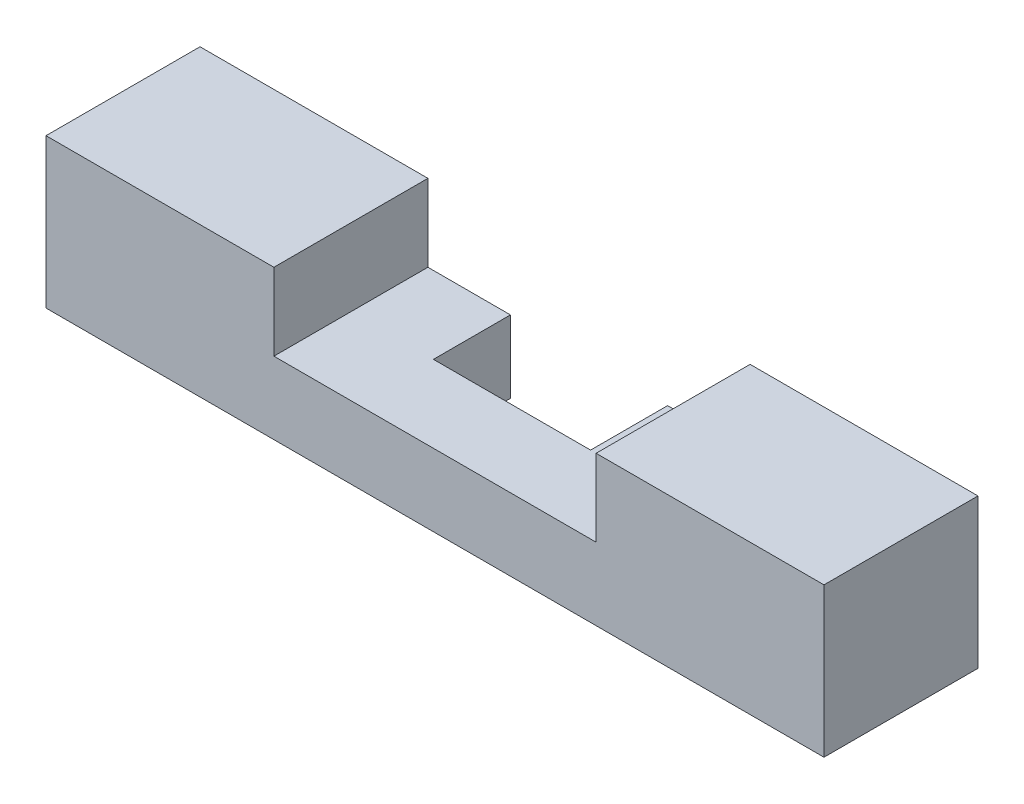
ISO-10303-21;
HEADER;
FILE_DESCRIPTION(('STEP AP214'),'2;1');
FILE_NAME('part.step','',(''),(''),'','','');
FILE_SCHEMA(('AUTOMOTIVE_DESIGN { 1 0 10303 214 1 1 1 1 }'));
ENDSEC;
DATA;
#1=APPLICATION_CONTEXT('core data for automotive mechanical design processes');
#2=APPLICATION_PROTOCOL_DEFINITION('international standard','automotive_design',2000,#1);
#3=PRODUCT_CONTEXT('',#1,'mechanical');
#4=PRODUCT('Part','Part','',(#3));
#5=PRODUCT_RELATED_PRODUCT_CATEGORY('part','',(#4));
#6=PRODUCT_DEFINITION_FORMATION('','',#4);
#7=PRODUCT_DEFINITION_CONTEXT('part definition',#1,'design');
#8=PRODUCT_DEFINITION('design','',#6,#7);
#9=PRODUCT_DEFINITION_SHAPE('','',#8);
#10=(LENGTH_UNIT() NAMED_UNIT(*) SI_UNIT(.MILLI.,.METRE.));
#11=(NAMED_UNIT(*) PLANE_ANGLE_UNIT() SI_UNIT($,.RADIAN.));
#12=(NAMED_UNIT(*) SI_UNIT($,.STERADIAN.) SOLID_ANGLE_UNIT());
#13=UNCERTAINTY_MEASURE_WITH_UNIT(LENGTH_MEASURE(1.E-05),#10,'distance_accuracy_value','');
#14=(GEOMETRIC_REPRESENTATION_CONTEXT(3) GLOBAL_UNCERTAINTY_ASSIGNED_CONTEXT((#13)) GLOBAL_UNIT_ASSIGNED_CONTEXT((#10,
#11,#12)) REPRESENTATION_CONTEXT('',''));
#15=CARTESIAN_POINT('',(0.,0.,0.));
#16=DIRECTION('',(0.,0.,1.));
#17=DIRECTION('',(1.,0.,0.));
#18=AXIS2_PLACEMENT_3D('',#15,#16,#17);
#19=CARTESIAN_POINT('',(0.,0.,0.));
#20=DIRECTION('',(0.,0.,1.));
#21=DIRECTION('',(1.,0.,0.));
#22=AXIS2_PLACEMENT_3D('',#19,#20,#21);
#23=PLANE('',#22);
#24=DIRECTION('',(0.,-1.,0.));
#25=VECTOR('',#24,1.);
#26=CARTESIAN_POINT('',(-10.,0.,0.));
#27=LINE('',#26,#25);
#28=CARTESIAN_POINT('',(-10.,-0.300000000000002,0.));
#29=VERTEX_POINT('',#28);
#30=CARTESIAN_POINT('',(-10.,-9.5,0.));
#31=VERTEX_POINT('',#30);
#32=EDGE_CURVE('E317',#29,#31,#27,.T.);
#33=ORIENTED_EDGE('',*,*,#32,.T.);
#34=DIRECTION('',(1.,0.,0.));
#35=VECTOR('',#34,1.);
#36=CARTESIAN_POINT('',(-49.5,-9.5,0.));
#37=LINE('',#36,#35);
#38=CARTESIAN_POINT('',(-49.5,-9.5,0.));
#39=VERTEX_POINT('',#38);
#40=EDGE_CURVE('E223',#39,#31,#37,.T.);
#41=ORIENTED_EDGE('',*,*,#40,.F.);
#42=DIRECTION('',(0.,-1.,0.));
#43=VECTOR('',#42,1.);
#44=CARTESIAN_POINT('',(-49.5,9.5,0.));
#45=LINE('',#44,#43);
#46=CARTESIAN_POINT('',(-49.5,9.5,0.));
#47=VERTEX_POINT('',#46);
#48=EDGE_CURVE('E365',#47,#39,#45,.T.);
#49=ORIENTED_EDGE('',*,*,#48,.F.);
#50=DIRECTION('',(-1.,0.,0.));
#51=VECTOR('',#50,1.);
#52=CARTESIAN_POINT('',(-49.5,9.5,0.));
#53=LINE('',#52,#51);
#54=CARTESIAN_POINT('',(-20.5,9.5,0.));
#55=VERTEX_POINT('',#54);
#56=EDGE_CURVE('E361',#55,#47,#53,.T.);
#57=ORIENTED_EDGE('',*,*,#56,.F.);
#58=DIRECTION('',(0.,1.,0.));
#59=VECTOR('',#58,1.);
#60=CARTESIAN_POINT('',(-20.5,-0.300000000000002,0.));
#61=LINE('',#60,#59);
#62=CARTESIAN_POINT('',(-20.5,-0.300000000000002,0.));
#63=VERTEX_POINT('',#62);
#64=EDGE_CURVE('E339',#63,#55,#61,.T.);
#65=ORIENTED_EDGE('',*,*,#64,.F.);
#66=DIRECTION('',(-1.,0.,0.));
#67=VECTOR('',#66,1.);
#68=CARTESIAN_POINT('',(20.5,-0.300000000000002,0.));
#69=LINE('',#68,#67);
#70=EDGE_CURVE('E332',#29,#63,#69,.T.);
#71=ORIENTED_EDGE('',*,*,#70,.F.);
#72=EDGE_LOOP('',(#33,#41,#49,#57,#65,#71));
#73=FACE_BOUND('',#72,.T.);
#74=ADVANCED_FACE('F34',(#73),#23,.F.);
#75=CARTESIAN_POINT('',(-49.5,-9.5,19.6));
#76=DIRECTION('',(0.,1.,0.));
#77=DIRECTION('',(0.,0.,1.));
#78=AXIS2_PLACEMENT_3D('',#75,#76,#77);
#79=PLANE('',#78);
#80=ORIENTED_EDGE('',*,*,#40,.T.);
#81=DIRECTION('',(0.,0.,1.));
#82=VECTOR('',#81,1.);
#83=CARTESIAN_POINT('',(-10.,-9.5,19.6));
#84=LINE('',#83,#82);
#85=CARTESIAN_POINT('',(-10.,-9.5,9.8));
#86=VERTEX_POINT('',#85);
#87=EDGE_CURVE('E203',#31,#86,#84,.T.);
#88=ORIENTED_EDGE('',*,*,#87,.T.);
#89=DIRECTION('',(1.,0.,0.));
#90=VECTOR('',#89,1.);
#91=CARTESIAN_POINT('',(-49.5,-9.5,9.8));
#92=LINE('',#91,#90);
#93=CARTESIAN_POINT('',(9.99999999999999,-9.5,9.8));
#94=VERTEX_POINT('',#93);
#95=EDGE_CURVE('E213',#86,#94,#92,.T.);
#96=ORIENTED_EDGE('',*,*,#95,.T.);
#97=DIRECTION('',(0.,0.,-1.));
#98=VECTOR('',#97,1.);
#99=CARTESIAN_POINT('',(9.99999999999999,-9.5,19.6));
#100=LINE('',#99,#98);
#101=CARTESIAN_POINT('',(9.99999999999999,-9.5,0.));
#102=VERTEX_POINT('',#101);
#103=EDGE_CURVE('E218',#94,#102,#100,.T.);
#104=ORIENTED_EDGE('',*,*,#103,.T.);
#105=CARTESIAN_POINT('',(49.5,-9.5,0.));
#106=VERTEX_POINT('',#105);
#107=EDGE_CURVE('E367',#102,#106,#37,.T.);
#108=ORIENTED_EDGE('',*,*,#107,.T.);
#109=DIRECTION('',(0.,0.,-1.));
#110=VECTOR('',#109,1.);
#111=CARTESIAN_POINT('',(49.5,-9.5,19.6));
#112=LINE('',#111,#110);
#113=CARTESIAN_POINT('',(49.5,-9.5,19.6));
#114=VERTEX_POINT('',#113);
#115=EDGE_CURVE('E359',#114,#106,#112,.T.);
#116=ORIENTED_EDGE('',*,*,#115,.F.);
#117=DIRECTION('',(1.,0.,0.));
#118=VECTOR('',#117,1.);
#119=CARTESIAN_POINT('',(-49.5,-9.5,19.6));
#120=LINE('',#119,#118);
#121=CARTESIAN_POINT('',(-49.5,-9.5,19.6));
#122=VERTEX_POINT('',#121);
#123=EDGE_CURVE('E357',#122,#114,#120,.T.);
#124=ORIENTED_EDGE('',*,*,#123,.F.);
#125=DIRECTION('',(0.,0.,-1.));
#126=VECTOR('',#125,1.);
#127=CARTESIAN_POINT('',(-49.5,-9.5,19.6));
#128=LINE('',#127,#126);
#129=EDGE_CURVE('E371',#122,#39,#128,.T.);
#130=ORIENTED_EDGE('',*,*,#129,.T.);
#131=EDGE_LOOP('',(#80,#88,#96,#104,#108,#116,#124,#130));
#132=FACE_BOUND('',#131,.T.);
#133=ADVANCED_FACE('F220',(#132),#79,.F.);
#134=CARTESIAN_POINT('',(-49.5,9.5,19.6));
#135=DIRECTION('',(0.,-1.,0.));
#136=DIRECTION('',(0.,0.,-1.));
#137=AXIS2_PLACEMENT_3D('',#134,#135,#136);
#138=PLANE('',#137);
#139=DIRECTION('',(-1.,0.,0.));
#140=VECTOR('',#139,1.);
#141=CARTESIAN_POINT('',(-49.5,9.5,19.6));
#142=LINE('',#141,#140);
#143=CARTESIAN_POINT('',(-20.5,9.5,19.6));
#144=VERTEX_POINT('',#143);
#145=CARTESIAN_POINT('',(-49.5,9.5,19.6));
#146=VERTEX_POINT('',#145);
#147=EDGE_CURVE('E351',#144,#146,#142,.T.);
#148=ORIENTED_EDGE('',*,*,#147,.F.);
#149=DIRECTION('',(0.,0.,1.));
#150=VECTOR('',#149,1.);
#151=CARTESIAN_POINT('',(-20.5,9.5,0.));
#152=LINE('',#151,#150);
#153=EDGE_CURVE('E322',#55,#144,#152,.T.);
#154=ORIENTED_EDGE('',*,*,#153,.F.);
#155=ORIENTED_EDGE('',*,*,#56,.T.);
#156=DIRECTION('',(0.,0.,-1.));
#157=VECTOR('',#156,1.);
#158=CARTESIAN_POINT('',(-49.5,9.5,19.6));
#159=LINE('',#158,#157);
#160=EDGE_CURVE('E373',#146,#47,#159,.T.);
#161=ORIENTED_EDGE('',*,*,#160,.F.);
#162=EDGE_LOOP('',(#148,#154,#155,#161));
#163=FACE_BOUND('',#162,.T.);
#164=ADVANCED_FACE('F392',(#163),#138,.F.);
#165=CARTESIAN_POINT('',(49.5,9.5,19.6));
#166=DIRECTION('',(-1.,0.,0.));
#167=DIRECTION('',(0.,0.,1.));
#168=AXIS2_PLACEMENT_3D('',#165,#166,#167);
#169=PLANE('',#168);
#170=DIRECTION('',(0.,0.,-1.));
#171=VECTOR('',#170,1.);
#172=CARTESIAN_POINT('',(49.5,9.5,19.6));
#173=LINE('',#172,#171);
#174=CARTESIAN_POINT('',(49.5,9.5,19.6));
#175=VERTEX_POINT('',#174);
#176=CARTESIAN_POINT('',(49.5,9.5,0.));
#177=VERTEX_POINT('',#176);
#178=EDGE_CURVE('E376',#175,#177,#173,.T.);
#179=ORIENTED_EDGE('',*,*,#178,.F.);
#180=DIRECTION('',(0.,1.,0.));
#181=VECTOR('',#180,1.);
#182=CARTESIAN_POINT('',(49.5,9.5,19.6));
#183=LINE('',#182,#181);
#184=EDGE_CURVE('E349',#114,#175,#183,.T.);
#185=ORIENTED_EDGE('',*,*,#184,.F.);
#186=ORIENTED_EDGE('',*,*,#115,.T.);
#187=DIRECTION('',(0.,1.,0.));
#188=VECTOR('',#187,1.);
#189=CARTESIAN_POINT('',(49.5,9.5,0.));
#190=LINE('',#189,#188);
#191=EDGE_CURVE('E341',#106,#177,#190,.T.);
#192=ORIENTED_EDGE('',*,*,#191,.T.);
#193=EDGE_LOOP('',(#179,#185,#186,#192));
#194=FACE_BOUND('',#193,.T.);
#195=ADVANCED_FACE('F36',(#194),#169,.F.);
#196=CARTESIAN_POINT('',(20.5,9.5,0.));
#197=VERTEX_POINT('',#196);
#198=EDGE_CURVE('E362',#177,#197,#53,.T.);
#199=ORIENTED_EDGE('',*,*,#198,.T.);
#200=DIRECTION('',(0.,0.,-1.));
#201=VECTOR('',#200,1.);
#202=CARTESIAN_POINT('',(20.5,9.5,0.));
#203=LINE('',#202,#201);
#204=CARTESIAN_POINT('',(20.5,9.5,19.6));
#205=VERTEX_POINT('',#204);
#206=EDGE_CURVE('E327',#205,#197,#203,.T.);
#207=ORIENTED_EDGE('',*,*,#206,.F.);
#208=EDGE_CURVE('E352',#175,#205,#142,.T.);
#209=ORIENTED_EDGE('',*,*,#208,.F.);
#210=ORIENTED_EDGE('',*,*,#178,.T.);
#211=EDGE_LOOP('',(#199,#207,#209,#210));
#212=FACE_BOUND('',#211,.T.);
#213=ADVANCED_FACE('F406',(#212),#138,.F.);
#214=CARTESIAN_POINT('',(-49.5,9.5,19.6));
#215=DIRECTION('',(1.,0.,0.));
#216=DIRECTION('',(0.,0.,-1.));
#217=AXIS2_PLACEMENT_3D('',#214,#215,#216);
#218=PLANE('',#217);
#219=ORIENTED_EDGE('',*,*,#48,.T.);
#220=ORIENTED_EDGE('',*,*,#129,.F.);
#221=DIRECTION('',(0.,-1.,0.));
#222=VECTOR('',#221,1.);
#223=CARTESIAN_POINT('',(-49.5,9.5,19.6));
#224=LINE('',#223,#222);
#225=EDGE_CURVE('E355',#146,#122,#224,.T.);
#226=ORIENTED_EDGE('',*,*,#225,.F.);
#227=ORIENTED_EDGE('',*,*,#160,.T.);
#228=EDGE_LOOP('',(#219,#220,#226,#227));
#229=FACE_BOUND('',#228,.T.);
#230=ADVANCED_FACE('F421',(#229),#218,.F.);
#231=CARTESIAN_POINT('',(0.,0.,19.6));
#232=DIRECTION('',(0.,0.,1.));
#233=DIRECTION('',(1.,0.,0.));
#234=AXIS2_PLACEMENT_3D('',#231,#232,#233);
#235=PLANE('',#234);
#236=ORIENTED_EDGE('',*,*,#225,.T.);
#237=ORIENTED_EDGE('',*,*,#123,.T.);
#238=ORIENTED_EDGE('',*,*,#184,.T.);
#239=ORIENTED_EDGE('',*,*,#208,.T.);
#240=DIRECTION('',(0.,1.,0.));
#241=VECTOR('',#240,1.);
#242=CARTESIAN_POINT('',(20.5,-0.300000000000002,19.6));
#243=LINE('',#242,#241);
#244=CARTESIAN_POINT('',(20.5,-0.300000000000002,19.6));
#245=VERTEX_POINT('',#244);
#246=EDGE_CURVE('E345',#245,#205,#243,.T.);
#247=ORIENTED_EDGE('',*,*,#246,.F.);
#248=DIRECTION('',(1.,0.,0.));
#249=VECTOR('',#248,1.);
#250=CARTESIAN_POINT('',(20.5,-0.300000000000002,19.6));
#251=LINE('',#250,#249);
#252=CARTESIAN_POINT('',(-20.5,-0.300000000000002,19.6));
#253=VERTEX_POINT('',#252);
#254=EDGE_CURVE('E326',#253,#245,#251,.T.);
#255=ORIENTED_EDGE('',*,*,#254,.F.);
#256=DIRECTION('',(0.,1.,0.));
#257=VECTOR('',#256,1.);
#258=CARTESIAN_POINT('',(-20.5,-0.300000000000002,19.6));
#259=LINE('',#258,#257);
#260=EDGE_CURVE('E336',#253,#144,#259,.T.);
#261=ORIENTED_EDGE('',*,*,#260,.T.);
#262=ORIENTED_EDGE('',*,*,#147,.T.);
#263=EDGE_LOOP('',(#236,#237,#238,#239,#247,#255,#261,#262));
#264=FACE_BOUND('',#263,.T.);
#265=ADVANCED_FACE('F396',(#264),#235,.T.);
#266=ORIENTED_EDGE('',*,*,#107,.F.);
#267=DIRECTION('',(0.,1.,0.));
#268=VECTOR('',#267,1.);
#269=CARTESIAN_POINT('',(10.,0.,0.));
#270=LINE('',#269,#268);
#271=CARTESIAN_POINT('',(10.,-0.300000000000002,0.));
#272=VERTEX_POINT('',#271);
#273=EDGE_CURVE('E320',#102,#272,#270,.T.);
#274=ORIENTED_EDGE('',*,*,#273,.T.);
#275=CARTESIAN_POINT('',(20.5,-0.300000000000002,0.));
#276=VERTEX_POINT('',#275);
#277=EDGE_CURVE('E333',#276,#272,#69,.T.);
#278=ORIENTED_EDGE('',*,*,#277,.F.);
#279=DIRECTION('',(0.,1.,0.));
#280=VECTOR('',#279,1.);
#281=CARTESIAN_POINT('',(20.5,-0.300000000000002,0.));
#282=LINE('',#281,#280);
#283=EDGE_CURVE('E342',#276,#197,#282,.T.);
#284=ORIENTED_EDGE('',*,*,#283,.T.);
#285=ORIENTED_EDGE('',*,*,#198,.F.);
#286=ORIENTED_EDGE('',*,*,#191,.F.);
#287=EDGE_LOOP('',(#266,#274,#278,#284,#285,#286));
#288=FACE_BOUND('',#287,.T.);
#289=ADVANCED_FACE('F412',(#288),#23,.F.);
#290=CARTESIAN_POINT('',(-20.5,-0.300000000000002,0.));
#291=DIRECTION('',(-1.,0.,0.));
#292=DIRECTION('',(0.,0.,1.));
#293=AXIS2_PLACEMENT_3D('',#290,#291,#292);
#294=PLANE('',#293);
#295=ORIENTED_EDGE('',*,*,#153,.T.);
#296=ORIENTED_EDGE('',*,*,#260,.F.);
#297=DIRECTION('',(0.,0.,1.));
#298=VECTOR('',#297,1.);
#299=CARTESIAN_POINT('',(-20.5,-0.300000000000002,0.));
#300=LINE('',#299,#298);
#301=EDGE_CURVE('E323',#63,#253,#300,.T.);
#302=ORIENTED_EDGE('',*,*,#301,.F.);
#303=ORIENTED_EDGE('',*,*,#64,.T.);
#304=EDGE_LOOP('',(#295,#296,#302,#303));
#305=FACE_BOUND('',#304,.T.);
#306=ADVANCED_FACE('F389',(#305),#294,.F.);
#307=CARTESIAN_POINT('',(20.5,-0.300000000000002,0.));
#308=DIRECTION('',(1.,0.,0.));
#309=DIRECTION('',(0.,0.,-1.));
#310=AXIS2_PLACEMENT_3D('',#307,#308,#309);
#311=PLANE('',#310);
#312=ORIENTED_EDGE('',*,*,#206,.T.);
#313=ORIENTED_EDGE('',*,*,#283,.F.);
#314=DIRECTION('',(0.,0.,-1.));
#315=VECTOR('',#314,1.);
#316=CARTESIAN_POINT('',(20.5,-0.300000000000002,0.));
#317=LINE('',#316,#315);
#318=EDGE_CURVE('E330',#245,#276,#317,.T.);
#319=ORIENTED_EDGE('',*,*,#318,.F.);
#320=ORIENTED_EDGE('',*,*,#246,.T.);
#321=EDGE_LOOP('',(#312,#313,#319,#320));
#322=FACE_BOUND('',#321,.T.);
#323=ADVANCED_FACE('F404',(#322),#311,.F.);
#324=CARTESIAN_POINT('',(0.,-0.300000000000002,0.));
#325=DIRECTION('',(0.,-1.,0.));
#326=DIRECTION('',(0.,0.,-1.));
#327=AXIS2_PLACEMENT_3D('',#324,#325,#326);
#328=PLANE('',#327);
#329=ORIENTED_EDGE('',*,*,#277,.T.);
#330=DIRECTION('',(0.,0.,-1.));
#331=VECTOR('',#330,1.);
#332=CARTESIAN_POINT('',(10.,-0.300000000000002,-9.8));
#333=LINE('',#332,#331);
#334=CARTESIAN_POINT('',(10.,-0.300000000000002,9.8));
#335=VERTEX_POINT('',#334);
#336=EDGE_CURVE('E310',#335,#272,#333,.T.);
#337=ORIENTED_EDGE('',*,*,#336,.F.);
#338=DIRECTION('',(1.,0.,0.));
#339=VECTOR('',#338,1.);
#340=CARTESIAN_POINT('',(-10.,-0.300000000000002,9.8));
#341=LINE('',#340,#339);
#342=CARTESIAN_POINT('',(-10.,-0.300000000000002,9.8));
#343=VERTEX_POINT('',#342);
#344=EDGE_CURVE('E210',#343,#335,#341,.T.);
#345=ORIENTED_EDGE('',*,*,#344,.F.);
#346=DIRECTION('',(0.,0.,-1.));
#347=VECTOR('',#346,1.);
#348=CARTESIAN_POINT('',(-10.,-0.300000000000002,0.));
#349=LINE('',#348,#347);
#350=EDGE_CURVE('E43',#343,#29,#349,.T.);
#351=ORIENTED_EDGE('',*,*,#350,.T.);
#352=ORIENTED_EDGE('',*,*,#70,.T.);
#353=ORIENTED_EDGE('',*,*,#301,.T.);
#354=ORIENTED_EDGE('',*,*,#254,.T.);
#355=ORIENTED_EDGE('',*,*,#318,.T.);
#356=EDGE_LOOP('',(#329,#337,#345,#351,#352,#353,#354,#355));
#357=FACE_BOUND('',#356,.T.);
#358=ADVANCED_FACE('F380',(#357),#328,.F.);
#359=CARTESIAN_POINT('',(10.,-15.8,-9.8));
#360=DIRECTION('',(1.,0.,0.));
#361=DIRECTION('',(0.,0.,-1.));
#362=AXIS2_PLACEMENT_3D('',#359,#360,#361);
#363=PLANE('',#362);
#364=ORIENTED_EDGE('',*,*,#273,.F.);
#365=ORIENTED_EDGE('',*,*,#103,.F.);
#366=DIRECTION('',(0.,1.,0.));
#367=VECTOR('',#366,1.);
#368=CARTESIAN_POINT('',(10.,-15.8,9.8));
#369=LINE('',#368,#367);
#370=EDGE_CURVE('E209',#94,#335,#369,.T.);
#371=ORIENTED_EDGE('',*,*,#370,.T.);
#372=ORIENTED_EDGE('',*,*,#336,.T.);
#373=EDGE_LOOP('',(#364,#365,#371,#372));
#374=FACE_BOUND('',#373,.T.);
#375=ADVANCED_FACE('F415',(#374),#363,.F.);
#376=CARTESIAN_POINT('',(-10.,-15.8,9.8));
#377=DIRECTION('',(0.,0.,1.));
#378=DIRECTION('',(1.,0.,0.));
#379=AXIS2_PLACEMENT_3D('',#376,#377,#378);
#380=PLANE('',#379);
#381=ORIENTED_EDGE('',*,*,#370,.F.);
#382=ORIENTED_EDGE('',*,*,#95,.F.);
#383=DIRECTION('',(0.,1.,0.));
#384=VECTOR('',#383,1.);
#385=CARTESIAN_POINT('',(-10.,-15.8,9.8));
#386=LINE('',#385,#384);
#387=EDGE_CURVE('E199',#86,#343,#386,.T.);
#388=ORIENTED_EDGE('',*,*,#387,.T.);
#389=ORIENTED_EDGE('',*,*,#344,.T.);
#390=EDGE_LOOP('',(#381,#382,#388,#389));
#391=FACE_BOUND('',#390,.T.);
#392=ADVANCED_FACE('F214',(#391),#380,.F.);
#393=CARTESIAN_POINT('',(-10.,-15.8,-9.8));
#394=DIRECTION('',(-1.,0.,0.));
#395=DIRECTION('',(0.,0.,1.));
#396=AXIS2_PLACEMENT_3D('',#393,#394,#395);
#397=PLANE('',#396);
#398=ORIENTED_EDGE('',*,*,#387,.F.);
#399=ORIENTED_EDGE('',*,*,#87,.F.);
#400=ORIENTED_EDGE('',*,*,#32,.F.);
#401=ORIENTED_EDGE('',*,*,#350,.F.);
#402=EDGE_LOOP('',(#398,#399,#400,#401));
#403=FACE_BOUND('',#402,.T.);
#404=ADVANCED_FACE('F201',(#403),#397,.F.);
#405=CLOSED_SHELL('',(#74,#133,#164,#195,#213,#230,#265,#289,#306,#323,#358,#375,#392,#404));
#406=CARTESIAN_POINT('',(0.,-9.,0.));
#407=DIRECTION('',(0.,1.,0.));
#408=DIRECTION('',(0.,0.,1.));
#409=AXIS2_PLACEMENT_3D('',#406,#407,#408);
#410=PLANE('',#409);
#411=DIRECTION('',(-1.,0.,0.));
#412=VECTOR('',#411,1.);
#413=CARTESIAN_POINT('',(0.,-9.,17.6));
#414=LINE('',#413,#412);
#415=CARTESIAN_POINT('',(47.5,-9.,17.6));
#416=VERTEX_POINT('',#415);
#417=CARTESIAN_POINT('',(-47.5,-9.,17.6));
#418=VERTEX_POINT('',#417);
#419=EDGE_CURVE('E58',#416,#418,#414,.T.);
#420=ORIENTED_EDGE('',*,*,#419,.F.);
#421=DIRECTION('',(0.,0.,-1.));
#422=VECTOR('',#421,1.);
#423=CARTESIAN_POINT('',(47.5,-9.,19.6));
#424=LINE('',#423,#422);
#425=CARTESIAN_POINT('',(47.5,-9.,2.));
#426=VERTEX_POINT('',#425);
#427=EDGE_CURVE('E241',#416,#426,#424,.T.);
#428=ORIENTED_EDGE('',*,*,#427,.T.);
#429=DIRECTION('',(-1.,0.,0.));
#430=VECTOR('',#429,1.);
#431=CARTESIAN_POINT('',(0.,-9.,2.));
#432=LINE('',#431,#430);
#433=CARTESIAN_POINT('',(12.,-9.,2.));
#434=VERTEX_POINT('',#433);
#435=EDGE_CURVE('E50',#426,#434,#432,.T.);
#436=ORIENTED_EDGE('',*,*,#435,.T.);
#437=DIRECTION('',(0.,0.,1.));
#438=VECTOR('',#437,1.);
#439=CARTESIAN_POINT('',(12.,-9.,-9.8));
#440=LINE('',#439,#438);
#441=CARTESIAN_POINT('',(12.,-9.,11.8));
#442=VERTEX_POINT('',#441);
#443=EDGE_CURVE('E227',#434,#442,#440,.T.);
#444=ORIENTED_EDGE('',*,*,#443,.T.);
#445=DIRECTION('',(-1.,0.,0.));
#446=VECTOR('',#445,1.);
#447=CARTESIAN_POINT('',(-10.,-9.,11.8));
#448=LINE('',#447,#446);
#449=CARTESIAN_POINT('',(-12.,-9.,11.8));
#450=VERTEX_POINT('',#449);
#451=EDGE_CURVE('E224',#442,#450,#448,.T.);
#452=ORIENTED_EDGE('',*,*,#451,.T.);
#453=DIRECTION('',(0.,0.,-1.));
#454=VECTOR('',#453,1.);
#455=CARTESIAN_POINT('',(-12.,-9.,-9.8));
#456=LINE('',#455,#454);
#457=CARTESIAN_POINT('',(-12.,-9.,2.));
#458=VERTEX_POINT('',#457);
#459=EDGE_CURVE('E11',#450,#458,#456,.T.);
#460=ORIENTED_EDGE('',*,*,#459,.T.);
#461=DIRECTION('',(-1.,0.,0.));
#462=VECTOR('',#461,1.);
#463=CARTESIAN_POINT('',(0.,-9.,2.));
#464=LINE('',#463,#462);
#465=CARTESIAN_POINT('',(-47.5,-9.,2.));
#466=VERTEX_POINT('',#465);
#467=EDGE_CURVE('E233',#458,#466,#464,.T.);
#468=ORIENTED_EDGE('',*,*,#467,.T.);
#469=DIRECTION('',(0.,0.,1.));
#470=VECTOR('',#469,1.);
#471=CARTESIAN_POINT('',(-47.5,-9.,19.6));
#472=LINE('',#471,#470);
#473=EDGE_CURVE('E236',#466,#418,#472,.T.);
#474=ORIENTED_EDGE('',*,*,#473,.T.);
#475=EDGE_LOOP('',(#420,#428,#436,#444,#452,#460,#468,#474));
#476=FACE_BOUND('',#475,.T.);
#477=ADVANCED_FACE('F498',(#476),#410,.T.);
#478=CARTESIAN_POINT('',(-49.5,7.5,19.6));
#479=DIRECTION('',(0.,-1.,0.));
#480=DIRECTION('',(0.,0.,-1.));
#481=AXIS2_PLACEMENT_3D('',#478,#479,#480);
#482=PLANE('',#481);
#483=DIRECTION('',(-1.,0.,0.));
#484=VECTOR('',#483,1.);
#485=CARTESIAN_POINT('',(-49.5,7.5,2.));
#486=LINE('',#485,#484);
#487=CARTESIAN_POINT('',(47.5,7.5,2.));
#488=VERTEX_POINT('',#487);
#489=CARTESIAN_POINT('',(22.5,7.5,2.));
#490=VERTEX_POINT('',#489);
#491=EDGE_CURVE('E259',#488,#490,#486,.T.);
#492=ORIENTED_EDGE('',*,*,#491,.F.);
#493=DIRECTION('',(0.,0.,-1.));
#494=VECTOR('',#493,1.);
#495=CARTESIAN_POINT('',(47.5,7.5,19.6));
#496=LINE('',#495,#494);
#497=CARTESIAN_POINT('',(47.5,7.5,17.6));
#498=VERTEX_POINT('',#497);
#499=EDGE_CURVE('E266',#498,#488,#496,.T.);
#500=ORIENTED_EDGE('',*,*,#499,.F.);
#501=DIRECTION('',(-1.,0.,0.));
#502=VECTOR('',#501,1.);
#503=CARTESIAN_POINT('',(-49.5,7.5,17.6));
#504=LINE('',#503,#502);
#505=CARTESIAN_POINT('',(22.5,7.5,17.6));
#506=VERTEX_POINT('',#505);
#507=EDGE_CURVE('E277',#498,#506,#504,.T.);
#508=ORIENTED_EDGE('',*,*,#507,.T.);
#509=DIRECTION('',(0.,0.,-1.));
#510=VECTOR('',#509,1.);
#511=CARTESIAN_POINT('',(22.5,7.5,0.));
#512=LINE('',#511,#510);
#513=EDGE_CURVE('E274',#506,#490,#512,.T.);
#514=ORIENTED_EDGE('',*,*,#513,.T.);
#515=EDGE_LOOP('',(#492,#500,#508,#514));
#516=FACE_BOUND('',#515,.T.);
#517=ADVANCED_FACE('F477',(#516),#482,.T.);
#518=CARTESIAN_POINT('',(22.5,-0.300000000000002,0.));
#519=DIRECTION('',(1.,0.,0.));
#520=DIRECTION('',(0.,0.,-1.));
#521=AXIS2_PLACEMENT_3D('',#518,#519,#520);
#522=PLANE('',#521);
#523=ORIENTED_EDGE('',*,*,#513,.F.);
#524=DIRECTION('',(0.,1.,0.));
#525=VECTOR('',#524,1.);
#526=CARTESIAN_POINT('',(22.5,0.,17.6));
#527=LINE('',#526,#525);
#528=CARTESIAN_POINT('',(22.5,-2.3,17.6));
#529=VERTEX_POINT('',#528);
#530=EDGE_CURVE('E258',#529,#506,#527,.T.);
#531=ORIENTED_EDGE('',*,*,#530,.F.);
#532=DIRECTION('',(0.,0.,-1.));
#533=VECTOR('',#532,1.);
#534=CARTESIAN_POINT('',(22.5,-2.3,0.));
#535=LINE('',#534,#533);
#536=CARTESIAN_POINT('',(22.5,-2.3,2.));
#537=VERTEX_POINT('',#536);
#538=EDGE_CURVE('E289',#529,#537,#535,.T.);
#539=ORIENTED_EDGE('',*,*,#538,.T.);
#540=DIRECTION('',(0.,1.,0.));
#541=VECTOR('',#540,1.);
#542=CARTESIAN_POINT('',(22.5,0.,2.));
#543=LINE('',#542,#541);
#544=EDGE_CURVE('E254',#537,#490,#543,.T.);
#545=ORIENTED_EDGE('',*,*,#544,.T.);
#546=EDGE_LOOP('',(#523,#531,#539,#545));
#547=FACE_BOUND('',#546,.T.);
#548=ADVANCED_FACE('F473',(#547),#522,.T.);
#549=DIRECTION('',(-1.,0.,0.));
#550=VECTOR('',#549,1.);
#551=CARTESIAN_POINT('',(-49.5,7.5,17.6));
#552=LINE('',#551,#550);
#553=CARTESIAN_POINT('',(-22.5,7.5,17.6));
#554=VERTEX_POINT('',#553);
#555=CARTESIAN_POINT('',(-47.5,7.5,17.6));
#556=VERTEX_POINT('',#555);
#557=EDGE_CURVE('E273',#554,#556,#552,.T.);
#558=ORIENTED_EDGE('',*,*,#557,.T.);
#559=DIRECTION('',(0.,0.,-1.));
#560=VECTOR('',#559,1.);
#561=CARTESIAN_POINT('',(-47.5,7.5,19.6));
#562=LINE('',#561,#560);
#563=CARTESIAN_POINT('',(-47.5,7.5,2.));
#564=VERTEX_POINT('',#563);
#565=EDGE_CURVE('E270',#556,#564,#562,.T.);
#566=ORIENTED_EDGE('',*,*,#565,.T.);
#567=DIRECTION('',(-1.,0.,0.));
#568=VECTOR('',#567,1.);
#569=CARTESIAN_POINT('',(-49.5,7.5,2.));
#570=LINE('',#569,#568);
#571=CARTESIAN_POINT('',(-22.5,7.5,2.));
#572=VERTEX_POINT('',#571);
#573=EDGE_CURVE('E263',#572,#564,#570,.T.);
#574=ORIENTED_EDGE('',*,*,#573,.F.);
#575=DIRECTION('',(0.,0.,1.));
#576=VECTOR('',#575,1.);
#577=CARTESIAN_POINT('',(-22.5,7.5,0.));
#578=LINE('',#577,#576);
#579=EDGE_CURVE('E247',#572,#554,#578,.T.);
#580=ORIENTED_EDGE('',*,*,#579,.T.);
#581=EDGE_LOOP('',(#558,#566,#574,#580));
#582=FACE_BOUND('',#581,.T.);
#583=ADVANCED_FACE('F476',(#582),#482,.T.);
#584=CARTESIAN_POINT('',(-22.5,-0.300000000000002,0.));
#585=DIRECTION('',(-1.,0.,0.));
#586=DIRECTION('',(0.,0.,1.));
#587=AXIS2_PLACEMENT_3D('',#584,#585,#586);
#588=PLANE('',#587);
#589=ORIENTED_EDGE('',*,*,#579,.F.);
#590=DIRECTION('',(0.,1.,0.));
#591=VECTOR('',#590,1.);
#592=CARTESIAN_POINT('',(-22.5,-0.300000000000002,2.));
#593=LINE('',#592,#591);
#594=CARTESIAN_POINT('',(-22.5,-2.3,2.));
#595=VERTEX_POINT('',#594);
#596=EDGE_CURVE('E257',#595,#572,#593,.T.);
#597=ORIENTED_EDGE('',*,*,#596,.F.);
#598=DIRECTION('',(0.,0.,1.));
#599=VECTOR('',#598,1.);
#600=CARTESIAN_POINT('',(-22.5,-2.3,0.));
#601=LINE('',#600,#599);
#602=CARTESIAN_POINT('',(-22.5,-2.3,17.6));
#603=VERTEX_POINT('',#602);
#604=EDGE_CURVE('E276',#595,#603,#601,.T.);
#605=ORIENTED_EDGE('',*,*,#604,.T.);
#606=DIRECTION('',(0.,1.,0.));
#607=VECTOR('',#606,1.);
#608=CARTESIAN_POINT('',(-22.5,-0.300000000000002,17.6));
#609=LINE('',#608,#607);
#610=EDGE_CURVE('E252',#603,#554,#609,.T.);
#611=ORIENTED_EDGE('',*,*,#610,.T.);
#612=EDGE_LOOP('',(#589,#597,#605,#611));
#613=FACE_BOUND('',#612,.T.);
#614=ADVANCED_FACE('F471',(#613),#588,.T.);
#615=CARTESIAN_POINT('',(0.,-2.3,0.));
#616=DIRECTION('',(0.,-1.,0.));
#617=DIRECTION('',(0.,0.,-1.));
#618=AXIS2_PLACEMENT_3D('',#615,#616,#617);
#619=PLANE('',#618);
#620=DIRECTION('',(-1.,0.,0.));
#621=VECTOR('',#620,1.);
#622=CARTESIAN_POINT('',(0.,-2.3,2.));
#623=LINE('',#622,#621);
#624=CARTESIAN_POINT('',(12.,-2.3,2.));
#625=VERTEX_POINT('',#624);
#626=EDGE_CURVE('E249',#537,#625,#623,.T.);
#627=ORIENTED_EDGE('',*,*,#626,.F.);
#628=ORIENTED_EDGE('',*,*,#538,.F.);
#629=DIRECTION('',(1.,0.,0.));
#630=VECTOR('',#629,1.);
#631=CARTESIAN_POINT('',(0.,-2.3,17.6));
#632=LINE('',#631,#630);
#633=EDGE_CURVE('E286',#603,#529,#632,.T.);
#634=ORIENTED_EDGE('',*,*,#633,.F.);
#635=ORIENTED_EDGE('',*,*,#604,.F.);
#636=DIRECTION('',(-1.,0.,0.));
#637=VECTOR('',#636,1.);
#638=CARTESIAN_POINT('',(0.,-2.3,2.));
#639=LINE('',#638,#637);
#640=CARTESIAN_POINT('',(-12.,-2.3,2.));
#641=VERTEX_POINT('',#640);
#642=EDGE_CURVE('E253',#641,#595,#639,.T.);
#643=ORIENTED_EDGE('',*,*,#642,.F.);
#644=DIRECTION('',(0.,0.,-1.));
#645=VECTOR('',#644,1.);
#646=CARTESIAN_POINT('',(-12.,-2.3,0.));
#647=LINE('',#646,#645);
#648=CARTESIAN_POINT('',(-12.,-2.3,11.8));
#649=VERTEX_POINT('',#648);
#650=EDGE_CURVE('E269',#649,#641,#647,.T.);
#651=ORIENTED_EDGE('',*,*,#650,.F.);
#652=DIRECTION('',(1.,0.,0.));
#653=VECTOR('',#652,1.);
#654=CARTESIAN_POINT('',(-10.,-2.3,11.8));
#655=LINE('',#654,#653);
#656=CARTESIAN_POINT('',(12.,-2.3,11.8));
#657=VERTEX_POINT('',#656);
#658=EDGE_CURVE('E304',#649,#657,#655,.T.);
#659=ORIENTED_EDGE('',*,*,#658,.T.);
#660=DIRECTION('',(0.,0.,-1.));
#661=VECTOR('',#660,1.);
#662=CARTESIAN_POINT('',(12.,-2.3,-9.8));
#663=LINE('',#662,#661);
#664=EDGE_CURVE('E244',#657,#625,#663,.T.);
#665=ORIENTED_EDGE('',*,*,#664,.T.);
#666=EDGE_LOOP('',(#627,#628,#634,#635,#643,#651,#659,#665));
#667=FACE_BOUND('',#666,.T.);
#668=ADVANCED_FACE('F468',(#667),#619,.T.);
#669=CARTESIAN_POINT('',(0.,0.,17.6));
#670=DIRECTION('',(0.,0.,1.));
#671=DIRECTION('',(1.,0.,0.));
#672=AXIS2_PLACEMENT_3D('',#669,#670,#671);
#673=PLANE('',#672);
#674=DIRECTION('',(0.,1.,0.));
#675=VECTOR('',#674,1.);
#676=CARTESIAN_POINT('',(47.5,9.5,17.6));
#677=LINE('',#676,#675);
#678=EDGE_CURVE('E271',#416,#498,#677,.T.);
#679=ORIENTED_EDGE('',*,*,#678,.F.);
#680=ORIENTED_EDGE('',*,*,#419,.T.);
#681=DIRECTION('',(0.,-1.,0.));
#682=VECTOR('',#681,1.);
#683=CARTESIAN_POINT('',(-47.5,9.5,17.6));
#684=LINE('',#683,#682);
#685=EDGE_CURVE('E280',#556,#418,#684,.T.);
#686=ORIENTED_EDGE('',*,*,#685,.F.);
#687=ORIENTED_EDGE('',*,*,#557,.F.);
#688=ORIENTED_EDGE('',*,*,#610,.F.);
#689=ORIENTED_EDGE('',*,*,#633,.T.);
#690=ORIENTED_EDGE('',*,*,#530,.T.);
#691=ORIENTED_EDGE('',*,*,#507,.F.);
#692=EDGE_LOOP('',(#679,#680,#686,#687,#688,#689,#690,#691));
#693=FACE_BOUND('',#692,.T.);
#694=ADVANCED_FACE('F457',(#693),#673,.F.);
#695=CARTESIAN_POINT('',(-12.,-15.8,-9.8));
#696=DIRECTION('',(-1.,0.,0.));
#697=DIRECTION('',(0.,0.,1.));
#698=AXIS2_PLACEMENT_3D('',#695,#696,#697);
#699=PLANE('',#698);
#700=ORIENTED_EDGE('',*,*,#459,.F.);
#701=DIRECTION('',(0.,1.,0.));
#702=VECTOR('',#701,1.);
#703=CARTESIAN_POINT('',(-12.,-15.8,11.8));
#704=LINE('',#703,#702);
#705=EDGE_CURVE('E307',#450,#649,#704,.T.);
#706=ORIENTED_EDGE('',*,*,#705,.T.);
#707=ORIENTED_EDGE('',*,*,#650,.T.);
#708=DIRECTION('',(0.,-1.,0.));
#709=VECTOR('',#708,1.);
#710=CARTESIAN_POINT('',(-12.,0.,2.));
#711=LINE('',#710,#709);
#712=EDGE_CURVE('E248',#641,#458,#711,.T.);
#713=ORIENTED_EDGE('',*,*,#712,.T.);
#714=EDGE_LOOP('',(#700,#706,#707,#713));
#715=FACE_BOUND('',#714,.T.);
#716=ADVANCED_FACE('F453',(#715),#699,.T.);
#717=CARTESIAN_POINT('',(-10.,-15.8,11.8));
#718=DIRECTION('',(0.,0.,1.));
#719=DIRECTION('',(1.,0.,0.));
#720=AXIS2_PLACEMENT_3D('',#717,#718,#719);
#721=PLANE('',#720);
#722=ORIENTED_EDGE('',*,*,#451,.F.);
#723=DIRECTION('',(0.,1.,0.));
#724=VECTOR('',#723,1.);
#725=CARTESIAN_POINT('',(12.,-15.8,11.8));
#726=LINE('',#725,#724);
#727=EDGE_CURVE('E298',#442,#657,#726,.T.);
#728=ORIENTED_EDGE('',*,*,#727,.T.);
#729=ORIENTED_EDGE('',*,*,#658,.F.);
#730=ORIENTED_EDGE('',*,*,#705,.F.);
#731=EDGE_LOOP('',(#722,#728,#729,#730));
#732=FACE_BOUND('',#731,.T.);
#733=ADVANCED_FACE('F456',(#732),#721,.T.);
#734=CARTESIAN_POINT('',(12.,-15.8,-9.8));
#735=DIRECTION('',(1.,0.,0.));
#736=DIRECTION('',(0.,0.,-1.));
#737=AXIS2_PLACEMENT_3D('',#734,#735,#736);
#738=PLANE('',#737);
#739=ORIENTED_EDGE('',*,*,#443,.F.);
#740=DIRECTION('',(0.,1.,0.));
#741=VECTOR('',#740,1.);
#742=CARTESIAN_POINT('',(12.,0.,2.));
#743=LINE('',#742,#741);
#744=EDGE_CURVE('E245',#434,#625,#743,.T.);
#745=ORIENTED_EDGE('',*,*,#744,.T.);
#746=ORIENTED_EDGE('',*,*,#664,.F.);
#747=ORIENTED_EDGE('',*,*,#727,.F.);
#748=EDGE_LOOP('',(#739,#745,#746,#747));
#749=FACE_BOUND('',#748,.T.);
#750=ADVANCED_FACE('F462',(#749),#738,.T.);
#751=CARTESIAN_POINT('',(0.,0.,2.));
#752=DIRECTION('',(0.,0.,1.));
#753=DIRECTION('',(1.,0.,0.));
#754=AXIS2_PLACEMENT_3D('',#751,#752,#753);
#755=PLANE('',#754);
#756=ORIENTED_EDGE('',*,*,#467,.F.);
#757=ORIENTED_EDGE('',*,*,#712,.F.);
#758=ORIENTED_EDGE('',*,*,#642,.T.);
#759=ORIENTED_EDGE('',*,*,#596,.T.);
#760=ORIENTED_EDGE('',*,*,#573,.T.);
#761=DIRECTION('',(0.,-1.,0.));
#762=VECTOR('',#761,1.);
#763=CARTESIAN_POINT('',(-47.5,9.5,2.));
#764=LINE('',#763,#762);
#765=EDGE_CURVE('E262',#564,#466,#764,.T.);
#766=ORIENTED_EDGE('',*,*,#765,.T.);
#767=EDGE_LOOP('',(#756,#757,#758,#759,#760,#766));
#768=FACE_BOUND('',#767,.T.);
#769=ADVANCED_FACE('F466',(#768),#755,.T.);
#770=CARTESIAN_POINT('',(-47.5,9.5,19.6));
#771=DIRECTION('',(1.,0.,0.));
#772=DIRECTION('',(0.,0.,-1.));
#773=AXIS2_PLACEMENT_3D('',#770,#771,#772);
#774=PLANE('',#773);
#775=ORIENTED_EDGE('',*,*,#473,.F.);
#776=ORIENTED_EDGE('',*,*,#765,.F.);
#777=ORIENTED_EDGE('',*,*,#565,.F.);
#778=ORIENTED_EDGE('',*,*,#685,.T.);
#779=EDGE_LOOP('',(#775,#776,#777,#778));
#780=FACE_BOUND('',#779,.T.);
#781=ADVANCED_FACE('F484',(#780),#774,.T.);
#782=CARTESIAN_POINT('',(47.5,9.5,19.6));
#783=DIRECTION('',(-1.,0.,0.));
#784=DIRECTION('',(0.,0.,1.));
#785=AXIS2_PLACEMENT_3D('',#782,#783,#784);
#786=PLANE('',#785);
#787=ORIENTED_EDGE('',*,*,#427,.F.);
#788=ORIENTED_EDGE('',*,*,#678,.T.);
#789=ORIENTED_EDGE('',*,*,#499,.T.);
#790=DIRECTION('',(0.,1.,0.));
#791=VECTOR('',#790,1.);
#792=CARTESIAN_POINT('',(47.5,9.5,2.));
#793=LINE('',#792,#791);
#794=EDGE_CURVE('E264',#426,#488,#793,.T.);
#795=ORIENTED_EDGE('',*,*,#794,.F.);
#796=EDGE_LOOP('',(#787,#788,#789,#795));
#797=FACE_BOUND('',#796,.T.);
#798=ADVANCED_FACE('F487',(#797),#786,.T.);
#799=ORIENTED_EDGE('',*,*,#435,.F.);
#800=ORIENTED_EDGE('',*,*,#794,.T.);
#801=ORIENTED_EDGE('',*,*,#491,.T.);
#802=ORIENTED_EDGE('',*,*,#544,.F.);
#803=ORIENTED_EDGE('',*,*,#626,.T.);
#804=ORIENTED_EDGE('',*,*,#744,.F.);
#805=EDGE_LOOP('',(#799,#800,#801,#802,#803,#804));
#806=FACE_BOUND('',#805,.T.);
#807=ADVANCED_FACE('F491',(#806),#755,.T.);
#808=CLOSED_SHELL('',(#477,#517,#548,#583,#614,#668,#694,#716,#733,#750,#769,#781,#798,#807));
#809=ORIENTED_CLOSED_SHELL('',*,#808,.T.);
#810=BREP_WITH_VOIDS('B2',#405,(#809));
#811=ADVANCED_BREP_SHAPE_REPRESENTATION('',(#18,#810),#14);
#812=SHAPE_DEFINITION_REPRESENTATION(#9,#811);
ENDSEC;
END-ISO-10303-21;
